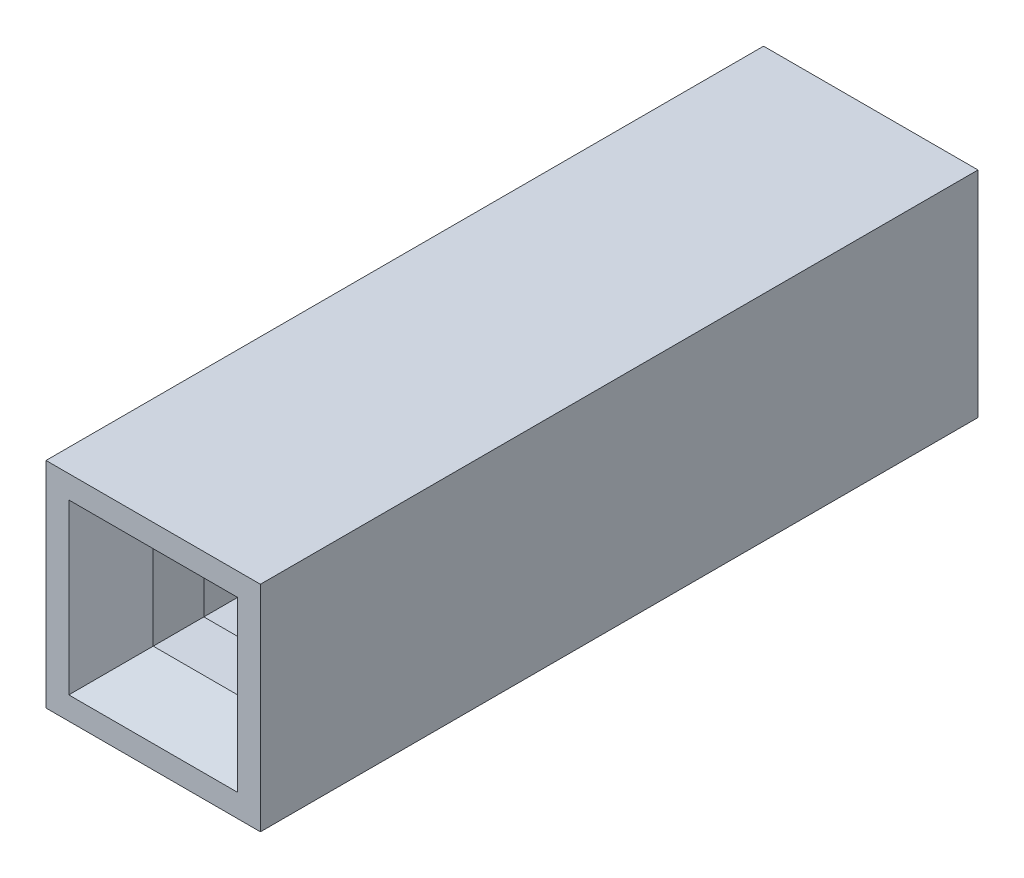
ISO-10303-21;
HEADER;
FILE_DESCRIPTION(('STEP AP214'),'2;1');
FILE_NAME('part.step','',(''),(''),'','','');
FILE_SCHEMA(('AUTOMOTIVE_DESIGN { 1 0 10303 214 1 1 1 1 }'));
ENDSEC;
DATA;
#1=APPLICATION_CONTEXT('core data for automotive mechanical design processes');
#2=APPLICATION_PROTOCOL_DEFINITION('international standard','automotive_design',2000,#1);
#3=PRODUCT_CONTEXT('',#1,'mechanical');
#4=PRODUCT('Part','Part','',(#3));
#5=PRODUCT_RELATED_PRODUCT_CATEGORY('part','',(#4));
#6=PRODUCT_DEFINITION_FORMATION('','',#4);
#7=PRODUCT_DEFINITION_CONTEXT('part definition',#1,'design');
#8=PRODUCT_DEFINITION('design','',#6,#7);
#9=PRODUCT_DEFINITION_SHAPE('','',#8);
#10=(LENGTH_UNIT() NAMED_UNIT(*) SI_UNIT(.MILLI.,.METRE.));
#11=(NAMED_UNIT(*) PLANE_ANGLE_UNIT() SI_UNIT($,.RADIAN.));
#12=(NAMED_UNIT(*) SI_UNIT($,.STERADIAN.) SOLID_ANGLE_UNIT());
#13=UNCERTAINTY_MEASURE_WITH_UNIT(LENGTH_MEASURE(1.E-05),#10,'distance_accuracy_value','');
#14=(GEOMETRIC_REPRESENTATION_CONTEXT(3) GLOBAL_UNCERTAINTY_ASSIGNED_CONTEXT((#13)) GLOBAL_UNIT_ASSIGNED_CONTEXT((#10,
#11,#12)) REPRESENTATION_CONTEXT('',''));
#15=CARTESIAN_POINT('',(0.,0.,0.));
#16=DIRECTION('',(0.,0.,1.));
#17=DIRECTION('',(1.,0.,0.));
#18=AXIS2_PLACEMENT_3D('',#15,#16,#17);
#19=CARTESIAN_POINT('',(10.12880036062,-23.17010036062,9.94999981073));
#20=DIRECTION('',(0.707106812095197,-3.09086338110098E-08,0.707106750277897));
#21=DIRECTION('',(0.,-1.,-4.37114110406421E-08));
#22=AXIS2_PLACEMENT_3D('',#19,#20,#21);
#23=PLANE('',#22);
#24=DIRECTION('',(0.577350243952825,-0.577350243952825,-0.577350319663225));
#25=VECTOR('',#24,1.);
#26=CARTESIAN_POINT('',(9.878800371557,-22.17010037156,10.19999986538));
#27=LINE('',#26,#25);
#28=CARTESIAN_POINT('',(9.878800371547,-22.17010037155,10.19999986537));
#29=VERTEX_POINT('',#28);
#30=CARTESIAN_POINT('',(10.37880034969,-22.67010034969,9.699999821658));
#31=VERTEX_POINT('',#30);
#32=EDGE_CURVE('E262',#29,#31,#27,.T.);
#33=ORIENTED_EDGE('',*,*,#32,.F.);
#34=DIRECTION('',(0.,1.,4.37164007210214E-08));
#35=VECTOR('',#34,1.);
#36=CARTESIAN_POINT('',(9.878800371557,-24.17010037156,10.19999977796));
#37=LINE('',#36,#35);
#38=CARTESIAN_POINT('',(9.878800371547,-24.17010037155,10.19999977795));
#39=VERTEX_POINT('',#38);
#40=EDGE_CURVE('E39',#39,#29,#37,.T.);
#41=ORIENTED_EDGE('',*,*,#40,.F.);
#42=DIRECTION('',(-0.577350243952825,-0.577350294426425,0.577350269189625));
#43=VECTOR('',#42,1.);
#44=CARTESIAN_POINT('',(10.3788003497,-23.6701003497,9.699999777956));
#45=LINE('',#44,#43);
#46=CARTESIAN_POINT('',(10.37880034969,-23.67010034969,9.699999777946));
#47=VERTEX_POINT('',#46);
#48=EDGE_CURVE('E226',#47,#39,#45,.T.);
#49=ORIENTED_EDGE('',*,*,#48,.F.);
#50=DIRECTION('',(0.,-1.,-4.37213971680827E-08));
#51=VECTOR('',#50,1.);
#52=CARTESIAN_POINT('',(10.3788003497,-22.6701003497,9.699999821668));
#53=LINE('',#52,#51);
#54=EDGE_CURVE('E27',#31,#47,#53,.T.);
#55=ORIENTED_EDGE('',*,*,#54,.F.);
#56=EDGE_LOOP('',(#33,#41,#49,#55));
#57=FACE_BOUND('',#56,.T.);
#58=ADVANCED_FACE('F17',(#57),#23,.T.);
#59=CARTESIAN_POINT('',(10.37880037155,-23.17010037155,10.1999997998));
#60=DIRECTION('',(1.,0.,-4.371138828674E-08));
#61=DIRECTION('',(0.,-1.,0.));
#62=AXIS2_PLACEMENT_3D('',#59,#60,#61);
#63=PLANE('',#62);
#64=DIRECTION('',(4.37280419260577E-08,-4.37281070591378E-08,1.));
#65=VECTOR('',#64,1.);
#66=CARTESIAN_POINT('',(10.37880032347,-23.67010032347,9.099999777956));
#67=LINE('',#66,#65);
#68=CARTESIAN_POINT('',(10.37880032346,-23.67010032346,9.099999777946));
#69=VERTEX_POINT('',#68);
#70=EDGE_CURVE('E197',#69,#47,#67,.T.);
#71=ORIENTED_EDGE('',*,*,#70,.F.);
#72=DIRECTION('',(0.,-1.,-4.37214096025828E-08));
#73=VECTOR('',#72,1.);
#74=CARTESIAN_POINT('',(10.37880032347,-22.67010032347,9.099999821668));
#75=LINE('',#74,#73);
#76=CARTESIAN_POINT('',(10.37880032346,-22.67010032346,9.099999821658));
#77=VERTEX_POINT('',#76);
#78=EDGE_CURVE('E20',#77,#69,#75,.T.);
#79=ORIENTED_EDGE('',*,*,#78,.F.);
#80=DIRECTION('',(4.37280419260577E-08,-4.37280952167678E-08,1.));
#81=VECTOR('',#80,1.);
#82=CARTESIAN_POINT('',(10.37880032347,-22.67010032347,9.099999821668));
#83=LINE('',#82,#81);
#84=EDGE_CURVE('E11',#77,#31,#83,.T.);
#85=ORIENTED_EDGE('',*,*,#84,.T.);
#86=ORIENTED_EDGE('',*,*,#54,.T.);
#87=EDGE_LOOP('',(#71,#79,#85,#86));
#88=FACE_BOUND('',#87,.T.);
#89=ADVANCED_FACE('F356',(#88),#63,.T.);
#90=CARTESIAN_POINT('',(10.87880037155,-22.67010037155,10.1999997998));
#91=DIRECTION('',(0.,-1.,-4.371140912996E-08));
#92=DIRECTION('',(0.,4.371140912996E-08,-1.));
#93=AXIS2_PLACEMENT_3D('',#90,#91,#92);
#94=PLANE('',#93);
#95=ORIENTED_EDGE('',*,*,#84,.F.);
#96=DIRECTION('',(-1.,0.,4.37213900626527E-08));
#97=VECTOR('',#96,1.);
#98=CARTESIAN_POINT('',(11.37880032347,-22.67010032347,9.099999777956));
#99=LINE('',#98,#97);
#100=CARTESIAN_POINT('',(11.37880032346,-22.67010032346,9.099999777946));
#101=VERTEX_POINT('',#100);
#102=EDGE_CURVE('E276',#101,#77,#99,.T.);
#103=ORIENTED_EDGE('',*,*,#102,.F.);
#104=DIRECTION('',(4.37280478472478E-08,-4.37281011379578E-08,1.));
#105=VECTOR('',#104,1.);
#106=CARTESIAN_POINT('',(11.37880032347,-22.67010032347,9.099999777956));
#107=LINE('',#106,#105);
#108=CARTESIAN_POINT('',(11.37880034969,-22.67010034969,9.699999777946));
#109=VERTEX_POINT('',#108);
#110=EDGE_CURVE('E256',#101,#109,#107,.T.);
#111=ORIENTED_EDGE('',*,*,#110,.T.);
#112=DIRECTION('',(-1.,0.,4.37214024971527E-08));
#113=VECTOR('',#112,1.);
#114=CARTESIAN_POINT('',(11.3788003497,-22.6701003497,9.699999777956));
#115=LINE('',#114,#113);
#116=EDGE_CURVE('E272',#109,#31,#115,.T.);
#117=ORIENTED_EDGE('',*,*,#116,.T.);
#118=EDGE_LOOP('',(#95,#103,#111,#117));
#119=FACE_BOUND('',#118,.T.);
#120=ADVANCED_FACE('F361',(#119),#94,.T.);
#121=CARTESIAN_POINT('',(10.87880036062,-22.42010036062,9.94999981073));
#122=DIRECTION('',(3.09086190726298E-08,-0.707106812095197,0.707106750277897));
#123=DIRECTION('',(-1.,-4.37113863760496E-08,0.));
#124=AXIS2_PLACEMENT_3D('',#121,#122,#123);
#125=PLANE('',#124);
#126=DIRECTION('',(0.577350294426425,0.577350243952825,0.577350269189625));
#127=VECTOR('',#126,1.);
#128=CARTESIAN_POINT('',(11.3788003497,-22.6701003497,9.699999777956));
#129=LINE('',#128,#127);
#130=CARTESIAN_POINT('',(11.87880037155,-22.17010037155,10.19999977795));
#131=VERTEX_POINT('',#130);
#132=EDGE_CURVE('E265',#109,#131,#129,.T.);
#133=ORIENTED_EDGE('',*,*,#132,.T.);
#134=DIRECTION('',(1.,0.,-4.37163882865214E-08));
#135=VECTOR('',#134,1.);
#136=CARTESIAN_POINT('',(9.878800371557,-22.17010037156,10.19999986538));
#137=LINE('',#136,#135);
#138=EDGE_CURVE('E94',#29,#131,#137,.T.);
#139=ORIENTED_EDGE('',*,*,#138,.F.);
#140=ORIENTED_EDGE('',*,*,#32,.T.);
#141=ORIENTED_EDGE('',*,*,#116,.F.);
#142=EDGE_LOOP('',(#133,#139,#140,#141));
#143=FACE_BOUND('',#142,.T.);
#144=ADVANCED_FACE('F364',(#143),#125,.T.);
#145=CARTESIAN_POINT('',(10.87880037155,-23.17010037155,10.19999977795));
#146=DIRECTION('',(4.37113882867399E-08,-4.37114091299599E-08,1.));
#147=DIRECTION('',(-0.707106949773929,-0.707106612599126,0.));
#148=AXIS2_PLACEMENT_3D('',#145,#146,#147);
#149=PLANE('',#148);
#150=DIRECTION('',(-1.,0.,4.37153232243519E-08));
#151=VECTOR('',#150,1.);
#152=CARTESIAN_POINT('',(12.14880037156,-24.44010037156,10.19999966693));
#153=LINE('',#152,#151);
#154=CARTESIAN_POINT('',(12.14880037155,-24.44010037155,10.19999966692));
#155=VERTEX_POINT('',#154);
#156=CARTESIAN_POINT('',(9.608800371547,-24.44010037155,10.19999977795));
#157=VERTEX_POINT('',#156);
#158=EDGE_CURVE('E211',#155,#157,#153,.T.);
#159=ORIENTED_EDGE('',*,*,#158,.F.);
#160=DIRECTION('',(0.,-1.,-4.37153525971818E-08));
#161=VECTOR('',#160,1.);
#162=CARTESIAN_POINT('',(12.14880037156,-21.90010037156,10.19999977796));
#163=LINE('',#162,#161);
#164=CARTESIAN_POINT('',(12.14880037155,-21.90010037155,10.19999977795));
#165=VERTEX_POINT('',#164);
#166=EDGE_CURVE('E86',#165,#155,#163,.T.);
#167=ORIENTED_EDGE('',*,*,#166,.F.);
#168=DIRECTION('',(1.,0.,-4.37153232243519E-08));
#169=VECTOR('',#168,1.);
#170=CARTESIAN_POINT('',(9.608800371557,-21.90010037156,10.19999988898));
#171=LINE('',#170,#169);
#172=CARTESIAN_POINT('',(9.608800371547,-21.90010037155,10.19999988897));
#173=VERTEX_POINT('',#172);
#174=EDGE_CURVE('E223',#173,#165,#171,.T.);
#175=ORIENTED_EDGE('',*,*,#174,.F.);
#176=DIRECTION('',(0.,1.,4.37153518978318E-08));
#177=VECTOR('',#176,1.);
#178=CARTESIAN_POINT('',(9.608800371557,-24.44010037156,10.19999977796));
#179=LINE('',#178,#177);
#180=EDGE_CURVE('E206',#157,#173,#179,.T.);
#181=ORIENTED_EDGE('',*,*,#180,.F.);
#182=EDGE_LOOP('',(#159,#167,#175,#181));
#183=FACE_BOUND('',#182,.T.);
#184=ORIENTED_EDGE('',*,*,#138,.T.);
#185=DIRECTION('',(0.,-1.,-4.37164007210214E-08));
#186=VECTOR('',#185,1.);
#187=CARTESIAN_POINT('',(11.87880037156,-22.17010037156,10.19999977796));
#188=LINE('',#187,#186);
#189=CARTESIAN_POINT('',(11.87880037155,-24.17010037155,10.19999969052));
#190=VERTEX_POINT('',#189);
#191=EDGE_CURVE('E232',#131,#190,#188,.T.);
#192=ORIENTED_EDGE('',*,*,#191,.T.);
#193=DIRECTION('',(-1.,0.,4.37163882865214E-08));
#194=VECTOR('',#193,1.);
#195=CARTESIAN_POINT('',(11.87880037156,-24.17010037156,10.19999969053));
#196=LINE('',#195,#194);
#197=EDGE_CURVE('E230',#190,#39,#196,.T.);
#198=ORIENTED_EDGE('',*,*,#197,.T.);
#199=ORIENTED_EDGE('',*,*,#40,.T.);
#200=EDGE_LOOP('',(#184,#192,#198,#199));
#201=FACE_BOUND('',#200,.T.);
#202=ADVANCED_FACE('F394',(#183,#201),#149,.T.);
#203=CARTESIAN_POINT('',(9.608800371547,-23.17010037155,10.19999983346));
#204=DIRECTION('',(-1.,0.,4.371138828674E-08));
#205=DIRECTION('',(0.,1.,0.));
#206=AXIS2_PLACEMENT_3D('',#203,#204,#205);
#207=PLANE('',#206);
#208=DIRECTION('',(4.37125651752367E-08,-4.37125869094867E-08,1.));
#209=VECTOR('',#208,1.);
#210=CARTESIAN_POINT('',(9.60880000001,-24.44010000001,1.699999777956));
#211=LINE('',#210,#209);
#212=CARTESIAN_POINT('',(9.6088,-24.4401,1.699999777946));
#213=VERTEX_POINT('',#212);
#214=EDGE_CURVE('E202',#213,#157,#211,.T.);
#215=ORIENTED_EDGE('',*,*,#214,.T.);
#216=ORIENTED_EDGE('',*,*,#180,.T.);
#217=DIRECTION('',(4.37125651752367E-08,-4.37125869094867E-08,1.));
#218=VECTOR('',#217,1.);
#219=CARTESIAN_POINT('',(9.60880000001,-21.90010000001,1.699999888983));
#220=LINE('',#219,#218);
#221=CARTESIAN_POINT('',(9.6088,-21.9001,1.699999888973));
#222=VERTEX_POINT('',#221);
#223=EDGE_CURVE('E229',#222,#173,#220,.T.);
#224=ORIENTED_EDGE('',*,*,#223,.F.);
#225=DIRECTION('',(0.,-1.,-4.37153482262318E-08));
#226=VECTOR('',#225,1.);
#227=CARTESIAN_POINT('',(9.60880000001,-21.90010000001,1.699999888983));
#228=LINE('',#227,#226);
#229=EDGE_CURVE('E237',#222,#213,#228,.T.);
#230=ORIENTED_EDGE('',*,*,#229,.T.);
#231=EDGE_LOOP('',(#215,#216,#224,#230));
#232=FACE_BOUND('',#231,.T.);
#233=ADVANCED_FACE('F379',(#232),#207,.T.);
#234=CARTESIAN_POINT('',(10.8788,-23.1701,1.699999777946));
#235=DIRECTION('',(4.37113882867399E-08,-4.37114091299599E-08,1.));
#236=DIRECTION('',(-0.707106949773929,-0.707106612599126,0.));
#237=AXIS2_PLACEMENT_3D('',#234,#235,#236);
#238=PLANE('',#237);
#239=ORIENTED_EDGE('',*,*,#229,.F.);
#240=DIRECTION('',(-1.,0.,4.37153202521018E-08));
#241=VECTOR('',#240,1.);
#242=CARTESIAN_POINT('',(12.14880000001,-21.90010000001,1.699999777956));
#243=LINE('',#242,#241);
#244=CARTESIAN_POINT('',(12.1488,-21.9001,1.699999777946));
#245=VERTEX_POINT('',#244);
#246=EDGE_CURVE('E219',#245,#222,#243,.T.);
#247=ORIENTED_EDGE('',*,*,#246,.F.);
#248=DIRECTION('',(0.,1.,4.37153481388118E-08));
#249=VECTOR('',#248,1.);
#250=CARTESIAN_POINT('',(12.14880000001,-24.44010000001,1.699999666929));
#251=LINE('',#250,#249);
#252=CARTESIAN_POINT('',(12.1488,-24.4401,1.699999666919));
#253=VERTEX_POINT('',#252);
#254=EDGE_CURVE('E243',#253,#245,#251,.T.);
#255=ORIENTED_EDGE('',*,*,#254,.F.);
#256=DIRECTION('',(1.,0.,-4.37153201646819E-08));
#257=VECTOR('',#256,1.);
#258=CARTESIAN_POINT('',(9.60880000001,-24.44010000001,1.699999777956));
#259=LINE('',#258,#257);
#260=EDGE_CURVE('E207',#213,#253,#259,.T.);
#261=ORIENTED_EDGE('',*,*,#260,.F.);
#262=EDGE_LOOP('',(#239,#247,#255,#261));
#263=FACE_BOUND('',#262,.T.);
#264=DIRECTION('',(0.,-1.,-4.37164078264414E-08));
#265=VECTOR('',#264,1.);
#266=CARTESIAN_POINT('',(11.87880000001,-22.17010000001,1.699999777956));
#267=LINE('',#266,#265);
#268=CARTESIAN_POINT('',(11.8788,-22.1701,1.699999777946));
#269=VERTEX_POINT('',#268);
#270=CARTESIAN_POINT('',(11.8788,-24.1701,1.699999690523));
#271=VERTEX_POINT('',#270);
#272=EDGE_CURVE('E181',#269,#271,#267,.T.);
#273=ORIENTED_EDGE('',*,*,#272,.F.);
#274=DIRECTION('',(1.,0.,-4.37163871763014E-08));
#275=VECTOR('',#274,1.);
#276=CARTESIAN_POINT('',(9.87880000001,-22.17010000001,1.699999865379));
#277=LINE('',#276,#275);
#278=CARTESIAN_POINT('',(9.8788,-22.1701,1.699999865369));
#279=VERTEX_POINT('',#278);
#280=EDGE_CURVE('E170',#279,#269,#277,.T.);
#281=ORIENTED_EDGE('',*,*,#280,.F.);
#282=DIRECTION('',(0.,1.,4.37164078264414E-08));
#283=VECTOR('',#282,1.);
#284=CARTESIAN_POINT('',(9.87880000001,-24.17010000001,1.699999777956));
#285=LINE('',#284,#283);
#286=CARTESIAN_POINT('',(9.8788,-24.1701,1.699999777946));
#287=VERTEX_POINT('',#286);
#288=EDGE_CURVE('E238',#287,#279,#285,.T.);
#289=ORIENTED_EDGE('',*,*,#288,.F.);
#290=DIRECTION('',(-1.,0.,4.37163871763014E-08));
#291=VECTOR('',#290,1.);
#292=CARTESIAN_POINT('',(11.87880000001,-24.17010000001,1.699999690533));
#293=LINE('',#292,#291);
#294=EDGE_CURVE('E184',#271,#287,#293,.T.);
#295=ORIENTED_EDGE('',*,*,#294,.F.);
#296=EDGE_LOOP('',(#273,#281,#289,#295));
#297=FACE_BOUND('',#296,.T.);
#298=ADVANCED_FACE('F182',(#263,#297),#238,.F.);
#299=CARTESIAN_POINT('',(10.8788,-24.1701,1.699999734235));
#300=DIRECTION('',(0.,-1.,-4.371140912996E-08));
#301=DIRECTION('',(0.,4.371140912996E-08,-1.));
#302=AXIS2_PLACEMENT_3D('',#299,#300,#301);
#303=PLANE('',#302);
#304=DIRECTION('',(-4.37127411743422E-08,4.37127594180022E-08,-1.));
#305=VECTOR('',#304,1.);
#306=CARTESIAN_POINT('',(11.87880032347,-24.17010032347,9.099999690533));
#307=LINE('',#306,#305);
#308=CARTESIAN_POINT('',(11.87880032346,-24.17010032346,9.099999690523));
#309=VERTEX_POINT('',#308);
#310=EDGE_CURVE('E316',#309,#271,#307,.T.);
#311=ORIENTED_EDGE('',*,*,#310,.T.);
#312=ORIENTED_EDGE('',*,*,#294,.T.);
#313=DIRECTION('',(-4.37127397340522E-08,4.37127584578122E-08,-1.));
#314=VECTOR('',#313,1.);
#315=CARTESIAN_POINT('',(9.878800323474,-24.17010032347,9.099999777956));
#316=LINE('',#315,#314);
#317=CARTESIAN_POINT('',(9.878800323464,-24.17010032346,9.099999777946));
#318=VERTEX_POINT('',#317);
#319=EDGE_CURVE('E241',#318,#287,#316,.T.);
#320=ORIENTED_EDGE('',*,*,#319,.F.);
#321=DIRECTION('',(1.,0.,-4.37163891747014E-08));
#322=VECTOR('',#321,1.);
#323=CARTESIAN_POINT('',(9.878800323474,-24.17010032347,9.099999777956));
#324=LINE('',#323,#322);
#325=EDGE_CURVE('E249',#318,#309,#324,.T.);
#326=ORIENTED_EDGE('',*,*,#325,.T.);
#327=EDGE_LOOP('',(#311,#312,#320,#326));
#328=FACE_BOUND('',#327,.T.);
#329=ADVANCED_FACE('F337',(#328),#303,.F.);
#330=CARTESIAN_POINT('',(10.87880032346,-23.17010032346,9.099999777946));
#331=DIRECTION('',(4.37113882867399E-08,-4.37114091299599E-08,1.));
#332=DIRECTION('',(-0.707106949773929,-0.707106612599126,0.));
#333=AXIS2_PLACEMENT_3D('',#330,#331,#332);
#334=PLANE('',#333);
#335=DIRECTION('',(0.,-1.,-4.37164078264414E-08));
#336=VECTOR('',#335,1.);
#337=CARTESIAN_POINT('',(9.878800323474,-22.17010032347,9.099999865379));
#338=LINE('',#337,#336);
#339=CARTESIAN_POINT('',(9.878800323464,-22.17010032346,9.099999865369));
#340=VERTEX_POINT('',#339);
#341=EDGE_CURVE('E242',#340,#318,#338,.T.);
#342=ORIENTED_EDGE('',*,*,#341,.F.);
#343=DIRECTION('',(-1.,0.,4.37163891747014E-08));
#344=VECTOR('',#343,1.);
#345=CARTESIAN_POINT('',(11.87880032347,-22.17010032347,9.099999777956));
#346=LINE('',#345,#344);
#347=CARTESIAN_POINT('',(11.87880032346,-22.17010032346,9.099999777946));
#348=VERTEX_POINT('',#347);
#349=EDGE_CURVE('E148',#348,#340,#346,.T.);
#350=ORIENTED_EDGE('',*,*,#349,.F.);
#351=DIRECTION('',(0.,1.,4.37164078264414E-08));
#352=VECTOR('',#351,1.);
#353=CARTESIAN_POINT('',(11.87880032347,-24.17010032347,9.099999690533));
#354=LINE('',#353,#352);
#355=EDGE_CURVE('E189',#309,#348,#354,.T.);
#356=ORIENTED_EDGE('',*,*,#355,.F.);
#357=ORIENTED_EDGE('',*,*,#325,.F.);
#358=EDGE_LOOP('',(#342,#350,#356,#357));
#359=FACE_BOUND('',#358,.T.);
#360=DIRECTION('',(1.,0.,-4.37213900626527E-08));
#361=VECTOR('',#360,1.);
#362=CARTESIAN_POINT('',(10.37880032347,-23.67010032347,9.099999777956));
#363=LINE('',#362,#361);
#364=CARTESIAN_POINT('',(11.37880032346,-23.67010032346,9.099999734235));
#365=VERTEX_POINT('',#364);
#366=EDGE_CURVE('E252',#69,#365,#363,.T.);
#367=ORIENTED_EDGE('',*,*,#366,.T.);
#368=DIRECTION('',(0.,1.,4.37214096025828E-08));
#369=VECTOR('',#368,1.);
#370=CARTESIAN_POINT('',(11.37880032347,-23.67010032347,9.099999734245));
#371=LINE('',#370,#369);
#372=EDGE_CURVE('E158',#365,#101,#371,.T.);
#373=ORIENTED_EDGE('',*,*,#372,.T.);
#374=ORIENTED_EDGE('',*,*,#102,.T.);
#375=ORIENTED_EDGE('',*,*,#78,.T.);
#376=EDGE_LOOP('',(#367,#373,#374,#375));
#377=FACE_BOUND('',#376,.T.);
#378=ADVANCED_FACE('F339',(#359,#377),#334,.F.);
#379=CARTESIAN_POINT('',(11.37880037155,-23.17010037155,10.19999975609));
#380=DIRECTION('',(-1.,0.,4.371138828674E-08));
#381=DIRECTION('',(0.,1.,0.));
#382=AXIS2_PLACEMENT_3D('',#379,#380,#381);
#383=PLANE('',#382);
#384=ORIENTED_EDGE('',*,*,#110,.F.);
#385=ORIENTED_EDGE('',*,*,#372,.F.);
#386=DIRECTION('',(4.37280419260577E-08,-4.37280833743878E-08,1.));
#387=VECTOR('',#386,1.);
#388=CARTESIAN_POINT('',(11.37880032347,-23.67010032347,9.099999734245));
#389=LINE('',#388,#387);
#390=CARTESIAN_POINT('',(11.37880034969,-23.67010034969,9.699999734235));
#391=VERTEX_POINT('',#390);
#392=EDGE_CURVE('E217',#365,#391,#389,.T.);
#393=ORIENTED_EDGE('',*,*,#392,.T.);
#394=DIRECTION('',(0.,1.,4.37213953917327E-08));
#395=VECTOR('',#394,1.);
#396=CARTESIAN_POINT('',(11.3788003497,-23.6701003497,9.699999734245));
#397=LINE('',#396,#395);
#398=EDGE_CURVE('E213',#391,#109,#397,.T.);
#399=ORIENTED_EDGE('',*,*,#398,.T.);
#400=EDGE_LOOP('',(#384,#385,#393,#399));
#401=FACE_BOUND('',#400,.T.);
#402=ADVANCED_FACE('F369',(#401),#383,.T.);
#403=CARTESIAN_POINT('',(11.62880036062,-23.17010036062,9.949999745163));
#404=DIRECTION('',(-0.707106750277897,-3.09086338110098E-08,0.707106812095197));
#405=DIRECTION('',(-4.37114110406421E-08,1.,0.));
#406=AXIS2_PLACEMENT_3D('',#403,#404,#405);
#407=PLANE('',#406);
#408=DIRECTION('',(0.577350294426391,-0.577350294426391,0.577350218716091));
#409=VECTOR('',#408,1.);
#410=CARTESIAN_POINT('',(11.3788003497,-23.6701003497,9.699999734245));
#411=LINE('',#410,#409);
#412=EDGE_CURVE('E218',#391,#190,#411,.T.);
#413=ORIENTED_EDGE('',*,*,#412,.T.);
#414=ORIENTED_EDGE('',*,*,#191,.F.);
#415=ORIENTED_EDGE('',*,*,#132,.F.);
#416=ORIENTED_EDGE('',*,*,#398,.F.);
#417=EDGE_LOOP('',(#413,#414,#415,#416));
#418=FACE_BOUND('',#417,.T.);
#419=ADVANCED_FACE('F366',(#418),#407,.T.);
#420=CARTESIAN_POINT('',(10.87880036062,-23.92010036062,9.949999745163));
#421=DIRECTION('',(3.09086190726298E-08,0.707106750277897,0.707106812095197));
#422=DIRECTION('',(1.,-4.37113901974244E-08,0.));
#423=AXIS2_PLACEMENT_3D('',#420,#421,#422);
#424=PLANE('',#423);
#425=ORIENTED_EDGE('',*,*,#48,.T.);
#426=ORIENTED_EDGE('',*,*,#197,.F.);
#427=ORIENTED_EDGE('',*,*,#412,.F.);
#428=DIRECTION('',(1.,1.00106581409363E-11,-4.37214007208028E-08));
#429=VECTOR('',#428,1.);
#430=CARTESIAN_POINT('',(10.3788003497,-23.6701003497,9.699999777956));
#431=LINE('',#430,#429);
#432=EDGE_CURVE('E192',#47,#391,#431,.T.);
#433=ORIENTED_EDGE('',*,*,#432,.F.);
#434=EDGE_LOOP('',(#425,#426,#427,#433));
#435=FACE_BOUND('',#434,.T.);
#436=ADVANCED_FACE('F368',(#435),#424,.T.);
#437=CARTESIAN_POINT('',(10.87880037155,-23.67010037155,10.19999975609));
#438=DIRECTION('',(0.,1.,4.371140912996E-08));
#439=DIRECTION('',(1.,0.,0.));
#440=AXIS2_PLACEMENT_3D('',#437,#438,#439);
#441=PLANE('',#440);
#442=ORIENTED_EDGE('',*,*,#392,.F.);
#443=ORIENTED_EDGE('',*,*,#366,.F.);
#444=ORIENTED_EDGE('',*,*,#70,.T.);
#445=ORIENTED_EDGE('',*,*,#432,.T.);
#446=EDGE_LOOP('',(#442,#443,#444,#445));
#447=FACE_BOUND('',#446,.T.);
#448=ADVANCED_FACE('F375',(#447),#441,.T.);
#449=CARTESIAN_POINT('',(11.8788,-23.1701,1.699999734235));
#450=DIRECTION('',(1.,0.,-4.371138828674E-08));
#451=DIRECTION('',(0.,-1.,0.));
#452=AXIS2_PLACEMENT_3D('',#449,#450,#451);
#453=PLANE('',#452);
#454=DIRECTION('',(-4.37127411743422E-08,4.37127594180022E-08,-1.));
#455=VECTOR('',#454,1.);
#456=CARTESIAN_POINT('',(11.87880032347,-22.17010032347,9.099999777956));
#457=LINE('',#456,#455);
#458=EDGE_CURVE('E174',#348,#269,#457,.T.);
#459=ORIENTED_EDGE('',*,*,#458,.T.);
#460=ORIENTED_EDGE('',*,*,#272,.T.);
#461=ORIENTED_EDGE('',*,*,#310,.F.);
#462=ORIENTED_EDGE('',*,*,#355,.T.);
#463=EDGE_LOOP('',(#459,#460,#461,#462));
#464=FACE_BOUND('',#463,.T.);
#465=ADVANCED_FACE('F190',(#464),#453,.F.);
#466=CARTESIAN_POINT('',(10.8788,-22.1701,1.699999821658));
#467=DIRECTION('',(0.,1.,4.371140912996E-08));
#468=DIRECTION('',(1.,0.,0.));
#469=AXIS2_PLACEMENT_3D('',#466,#467,#468);
#470=PLANE('',#469);
#471=DIRECTION('',(-4.37127397340522E-08,4.37127584578122E-08,-1.));
#472=VECTOR('',#471,1.);
#473=CARTESIAN_POINT('',(9.878800323474,-22.17010032347,9.099999865379));
#474=LINE('',#473,#472);
#475=EDGE_CURVE('E176',#340,#279,#474,.T.);
#476=ORIENTED_EDGE('',*,*,#475,.T.);
#477=ORIENTED_EDGE('',*,*,#280,.T.);
#478=ORIENTED_EDGE('',*,*,#458,.F.);
#479=ORIENTED_EDGE('',*,*,#349,.T.);
#480=EDGE_LOOP('',(#476,#477,#478,#479));
#481=FACE_BOUND('',#480,.T.);
#482=ADVANCED_FACE('F172',(#481),#470,.F.);
#483=CARTESIAN_POINT('',(9.8788,-23.1701,1.699999821658));
#484=DIRECTION('',(-1.,0.,4.371138828674E-08));
#485=DIRECTION('',(0.,1.,0.));
#486=AXIS2_PLACEMENT_3D('',#483,#484,#485);
#487=PLANE('',#486);
#488=ORIENTED_EDGE('',*,*,#319,.T.);
#489=ORIENTED_EDGE('',*,*,#288,.T.);
#490=ORIENTED_EDGE('',*,*,#475,.F.);
#491=ORIENTED_EDGE('',*,*,#341,.T.);
#492=EDGE_LOOP('',(#488,#489,#490,#491));
#493=FACE_BOUND('',#492,.T.);
#494=ADVANCED_FACE('F342',(#493),#487,.F.);
#495=CARTESIAN_POINT('',(10.87880037155,-24.44010037155,10.19999972243));
#496=DIRECTION('',(0.,-1.,-4.371140912996E-08));
#497=DIRECTION('',(0.,4.371140912996E-08,-1.));
#498=AXIS2_PLACEMENT_3D('',#495,#496,#497);
#499=PLANE('',#498);
#500=DIRECTION('',(4.37125649662567E-08,-4.37125860735567E-08,1.));
#501=VECTOR('',#500,1.);
#502=CARTESIAN_POINT('',(12.14880000001,-24.44010000001,1.699999666929));
#503=LINE('',#502,#501);
#504=EDGE_CURVE('E279',#253,#155,#503,.T.);
#505=ORIENTED_EDGE('',*,*,#504,.T.);
#506=ORIENTED_EDGE('',*,*,#158,.T.);
#507=ORIENTED_EDGE('',*,*,#214,.F.);
#508=ORIENTED_EDGE('',*,*,#260,.T.);
#509=EDGE_LOOP('',(#505,#506,#507,#508));
#510=FACE_BOUND('',#509,.T.);
#511=ADVANCED_FACE('F344',(#510),#499,.T.);
#512=CARTESIAN_POINT('',(12.14880037155,-23.17010037155,10.19999972243));
#513=DIRECTION('',(1.,0.,-4.371138828674E-08));
#514=DIRECTION('',(0.,-1.,0.));
#515=AXIS2_PLACEMENT_3D('',#512,#513,#514);
#516=PLANE('',#515);
#517=DIRECTION('',(4.37125647572768E-08,-4.37125864915267E-08,1.));
#518=VECTOR('',#517,1.);
#519=CARTESIAN_POINT('',(12.14880000001,-21.90010000001,1.699999777956));
#520=LINE('',#519,#518);
#521=EDGE_CURVE('E212',#245,#165,#520,.T.);
#522=ORIENTED_EDGE('',*,*,#521,.T.);
#523=ORIENTED_EDGE('',*,*,#166,.T.);
#524=ORIENTED_EDGE('',*,*,#504,.F.);
#525=ORIENTED_EDGE('',*,*,#254,.T.);
#526=EDGE_LOOP('',(#522,#523,#524,#525));
#527=FACE_BOUND('',#526,.T.);
#528=ADVANCED_FACE('F350',(#527),#516,.T.);
#529=CARTESIAN_POINT('',(10.87880037155,-21.90010037155,10.19999983346));
#530=DIRECTION('',(0.,1.,4.371140912996E-08));
#531=DIRECTION('',(1.,0.,0.));
#532=AXIS2_PLACEMENT_3D('',#529,#530,#531);
#533=PLANE('',#532);
#534=ORIENTED_EDGE('',*,*,#223,.T.);
#535=ORIENTED_EDGE('',*,*,#174,.T.);
#536=ORIENTED_EDGE('',*,*,#521,.F.);
#537=ORIENTED_EDGE('',*,*,#246,.T.);
#538=EDGE_LOOP('',(#534,#535,#536,#537));
#539=FACE_BOUND('',#538,.T.);
#540=ADVANCED_FACE('F391',(#539),#533,.T.);
#541=CLOSED_SHELL('',(#58,#89,#120,#144,#202,#233,#298,#329,#378,#402,#419,#436,#448,#465,#482,
#494,#511,#528,#540));
#542=MANIFOLD_SOLID_BREP('B1',#541);
#543=ADVANCED_BREP_SHAPE_REPRESENTATION('',(#18,#542),#14);
#544=SHAPE_DEFINITION_REPRESENTATION(#9,#543);
ENDSEC;
END-ISO-10303-21;
